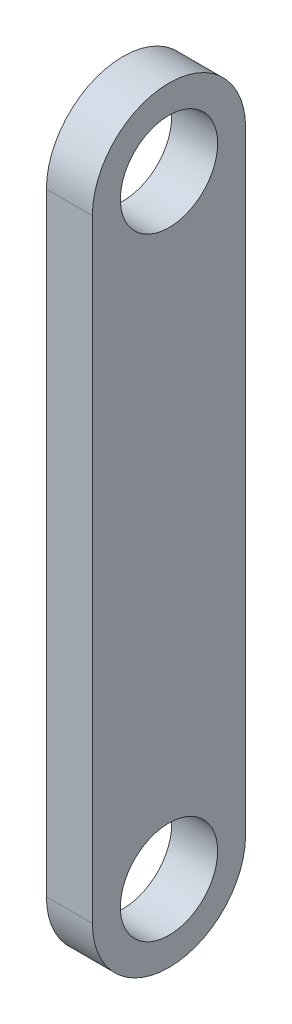
ISO-10303-21;
HEADER;
FILE_DESCRIPTION(('STEP AP214'),'2;1');
FILE_NAME('part.step','',(''),(''),'','','');
FILE_SCHEMA(('AUTOMOTIVE_DESIGN { 1 0 10303 214 1 1 1 1 }'));
ENDSEC;
DATA;
#1=APPLICATION_CONTEXT('core data for automotive mechanical design processes');
#2=APPLICATION_PROTOCOL_DEFINITION('international standard','automotive_design',2000,#1);
#3=PRODUCT_CONTEXT('',#1,'mechanical');
#4=PRODUCT('Part','Part','',(#3));
#5=PRODUCT_RELATED_PRODUCT_CATEGORY('part','',(#4));
#6=PRODUCT_DEFINITION_FORMATION('','',#4);
#7=PRODUCT_DEFINITION_CONTEXT('part definition',#1,'design');
#8=PRODUCT_DEFINITION('design','',#6,#7);
#9=PRODUCT_DEFINITION_SHAPE('','',#8);
#10=(LENGTH_UNIT() NAMED_UNIT(*) SI_UNIT(.MILLI.,.METRE.));
#11=(NAMED_UNIT(*) PLANE_ANGLE_UNIT() SI_UNIT($,.RADIAN.));
#12=(NAMED_UNIT(*) SI_UNIT($,.STERADIAN.) SOLID_ANGLE_UNIT());
#13=UNCERTAINTY_MEASURE_WITH_UNIT(LENGTH_MEASURE(1.E-05),#10,'distance_accuracy_value','');
#14=(GEOMETRIC_REPRESENTATION_CONTEXT(3) GLOBAL_UNCERTAINTY_ASSIGNED_CONTEXT((#13)) GLOBAL_UNIT_ASSIGNED_CONTEXT((#10,
#11,#12)) REPRESENTATION_CONTEXT('',''));
#15=CARTESIAN_POINT('',(0.,0.,0.));
#16=DIRECTION('',(0.,0.,1.));
#17=DIRECTION('',(1.,0.,0.));
#18=AXIS2_PLACEMENT_3D('',#15,#16,#17);
#19=CARTESIAN_POINT('',(3.,-20.,0.));
#20=DIRECTION('',(-1.,0.,0.));
#21=DIRECTION('',(0.,0.,1.));
#22=AXIS2_PLACEMENT_3D('',#19,#20,#21);
#23=CYLINDRICAL_SURFACE('',#22,5.);
#24=DIRECTION('',(-1.,0.,0.));
#25=VECTOR('',#24,1.);
#26=CARTESIAN_POINT('',(3.,-20.,-5.));
#27=LINE('',#26,#25);
#28=CARTESIAN_POINT('',(3.,-20.,-5.));
#29=VERTEX_POINT('',#28);
#30=CARTESIAN_POINT('',(0.,-20.,-5.));
#31=VERTEX_POINT('',#30);
#32=EDGE_CURVE('E90',#29,#31,#27,.T.);
#33=ORIENTED_EDGE('',*,*,#32,.F.);
#34=CARTESIAN_POINT('',(3.,-20.,0.));
#35=DIRECTION('',(-1.,0.,0.));
#36=DIRECTION('',(0.,0.,1.));
#37=AXIS2_PLACEMENT_3D('',#34,#35,#36);
#38=CIRCLE('',#37,5.);
#39=CARTESIAN_POINT('',(3.,-20.,5.));
#40=VERTEX_POINT('',#39);
#41=EDGE_CURVE('E44',#40,#29,#38,.F.);
#42=ORIENTED_EDGE('',*,*,#41,.F.);
#43=DIRECTION('',(1.,0.,0.));
#44=VECTOR('',#43,1.);
#45=CARTESIAN_POINT('',(3.,-20.,5.));
#46=LINE('',#45,#44);
#47=CARTESIAN_POINT('',(0.,-20.,5.));
#48=VERTEX_POINT('',#47);
#49=EDGE_CURVE('E107',#48,#40,#46,.T.);
#50=ORIENTED_EDGE('',*,*,#49,.F.);
#51=CARTESIAN_POINT('',(0.,-20.,0.));
#52=DIRECTION('',(-1.,0.,0.));
#53=DIRECTION('',(0.,0.,1.));
#54=AXIS2_PLACEMENT_3D('',#51,#52,#53);
#55=CIRCLE('',#54,5.);
#56=EDGE_CURVE('E11',#31,#48,#55,.T.);
#57=ORIENTED_EDGE('',*,*,#56,.F.);
#58=EDGE_LOOP('',(#33,#42,#50,#57));
#59=FACE_BOUND('',#58,.T.);
#60=ADVANCED_FACE('F36',(#59),#23,.T.);
#61=CARTESIAN_POINT('',(3.,20.,0.));
#62=DIRECTION('',(-1.,0.,0.));
#63=DIRECTION('',(0.,0.,1.));
#64=AXIS2_PLACEMENT_3D('',#61,#62,#63);
#65=CYLINDRICAL_SURFACE('',#64,5.);
#66=DIRECTION('',(-1.,0.,0.));
#67=VECTOR('',#66,1.);
#68=CARTESIAN_POINT('',(3.,20.,5.));
#69=LINE('',#68,#67);
#70=CARTESIAN_POINT('',(3.,20.,5.));
#71=VERTEX_POINT('',#70);
#72=CARTESIAN_POINT('',(0.,20.,5.));
#73=VERTEX_POINT('',#72);
#74=EDGE_CURVE('E87',#71,#73,#69,.T.);
#75=ORIENTED_EDGE('',*,*,#74,.F.);
#76=CARTESIAN_POINT('',(3.,20.,0.));
#77=DIRECTION('',(-1.,0.,0.));
#78=DIRECTION('',(0.,0.,1.));
#79=AXIS2_PLACEMENT_3D('',#76,#77,#78);
#80=CIRCLE('',#79,5.);
#81=CARTESIAN_POINT('',(3.,20.,-5.));
#82=VERTEX_POINT('',#81);
#83=EDGE_CURVE('E91',#82,#71,#80,.F.);
#84=ORIENTED_EDGE('',*,*,#83,.F.);
#85=DIRECTION('',(1.,0.,0.));
#86=VECTOR('',#85,1.);
#87=CARTESIAN_POINT('',(3.,20.,-5.));
#88=LINE('',#87,#86);
#89=CARTESIAN_POINT('',(0.,20.,-5.));
#90=VERTEX_POINT('',#89);
#91=EDGE_CURVE('E89',#90,#82,#88,.T.);
#92=ORIENTED_EDGE('',*,*,#91,.F.);
#93=CARTESIAN_POINT('',(0.,20.,0.));
#94=DIRECTION('',(-1.,0.,0.));
#95=DIRECTION('',(0.,0.,1.));
#96=AXIS2_PLACEMENT_3D('',#93,#94,#95);
#97=CIRCLE('',#96,5.);
#98=EDGE_CURVE('E76',#73,#90,#97,.T.);
#99=ORIENTED_EDGE('',*,*,#98,.F.);
#100=EDGE_LOOP('',(#75,#84,#92,#99));
#101=FACE_BOUND('',#100,.T.);
#102=ADVANCED_FACE('F85',(#101),#65,.T.);
#103=CARTESIAN_POINT('',(3.,-25.,5.));
#104=DIRECTION('',(0.,0.,1.));
#105=DIRECTION('',(1.,0.,0.));
#106=AXIS2_PLACEMENT_3D('',#103,#104,#105);
#107=PLANE('',#106);
#108=DIRECTION('',(0.,1.,0.));
#109=VECTOR('',#108,1.);
#110=CARTESIAN_POINT('',(0.,-25.,5.));
#111=LINE('',#110,#109);
#112=EDGE_CURVE('E73',#48,#73,#111,.T.);
#113=ORIENTED_EDGE('',*,*,#112,.F.);
#114=ORIENTED_EDGE('',*,*,#49,.T.);
#115=DIRECTION('',(0.,1.,0.));
#116=VECTOR('',#115,1.);
#117=CARTESIAN_POINT('',(3.,-25.,5.));
#118=LINE('',#117,#116);
#119=EDGE_CURVE('E95',#40,#71,#118,.T.);
#120=ORIENTED_EDGE('',*,*,#119,.T.);
#121=ORIENTED_EDGE('',*,*,#74,.T.);
#122=EDGE_LOOP('',(#113,#114,#120,#121));
#123=FACE_BOUND('',#122,.T.);
#124=ADVANCED_FACE('F93',(#123),#107,.T.);
#125=CARTESIAN_POINT('',(3.,-25.,-5.));
#126=DIRECTION('',(0.,0.,1.));
#127=DIRECTION('',(1.,0.,0.));
#128=AXIS2_PLACEMENT_3D('',#125,#126,#127);
#129=PLANE('',#128);
#130=DIRECTION('',(0.,1.,0.));
#131=VECTOR('',#130,1.);
#132=CARTESIAN_POINT('',(3.,-25.,-5.));
#133=LINE('',#132,#131);
#134=EDGE_CURVE('E97',#29,#82,#133,.T.);
#135=ORIENTED_EDGE('',*,*,#134,.F.);
#136=ORIENTED_EDGE('',*,*,#32,.T.);
#137=DIRECTION('',(0.,1.,0.));
#138=VECTOR('',#137,1.);
#139=CARTESIAN_POINT('',(0.,-25.,-5.));
#140=LINE('',#139,#138);
#141=EDGE_CURVE('E80',#31,#90,#140,.T.);
#142=ORIENTED_EDGE('',*,*,#141,.T.);
#143=ORIENTED_EDGE('',*,*,#91,.T.);
#144=EDGE_LOOP('',(#135,#136,#142,#143));
#145=FACE_BOUND('',#144,.T.);
#146=ADVANCED_FACE('F112',(#145),#129,.F.);
#147=CARTESIAN_POINT('',(3.,0.,0.));
#148=DIRECTION('',(-1.,0.,0.));
#149=DIRECTION('',(0.,0.,1.));
#150=AXIS2_PLACEMENT_3D('',#147,#148,#149);
#151=PLANE('',#150);
#152=CARTESIAN_POINT('',(3.,20.,0.));
#153=DIRECTION('',(1.,0.,0.));
#154=DIRECTION('',(0.,0.,-1.));
#155=AXIS2_PLACEMENT_3D('',#152,#153,#154);
#156=CIRCLE('',#155,3.175);
#157=CARTESIAN_POINT('',(3.,20.,-3.175));
#158=VERTEX_POINT('',#157);
#159=EDGE_CURVE('E117',#158,#158,#156,.T.);
#160=ORIENTED_EDGE('',*,*,#159,.F.);
#161=EDGE_LOOP('',(#160));
#162=FACE_BOUND('',#161,.T.);
#163=CARTESIAN_POINT('',(3.,-20.,0.));
#164=DIRECTION('',(1.,0.,0.));
#165=DIRECTION('',(0.,0.,-1.));
#166=AXIS2_PLACEMENT_3D('',#163,#164,#165);
#167=CIRCLE('',#166,3.175);
#168=CARTESIAN_POINT('',(3.,-20.,-3.175));
#169=VERTEX_POINT('',#168);
#170=EDGE_CURVE('E122',#169,#169,#167,.T.);
#171=ORIENTED_EDGE('',*,*,#170,.F.);
#172=EDGE_LOOP('',(#171));
#173=FACE_BOUND('',#172,.T.);
#174=ORIENTED_EDGE('',*,*,#119,.F.);
#175=ORIENTED_EDGE('',*,*,#41,.T.);
#176=ORIENTED_EDGE('',*,*,#134,.T.);
#177=ORIENTED_EDGE('',*,*,#83,.T.);
#178=EDGE_LOOP('',(#174,#175,#176,#177));
#179=FACE_BOUND('',#178,.T.);
#180=ADVANCED_FACE('F109',(#162,#173,#179),#151,.F.);
#181=CARTESIAN_POINT('',(0.,0.,0.));
#182=DIRECTION('',(-1.,0.,0.));
#183=DIRECTION('',(0.,0.,1.));
#184=AXIS2_PLACEMENT_3D('',#181,#182,#183);
#185=PLANE('',#184);
#186=CARTESIAN_POINT('',(0.,20.,0.));
#187=DIRECTION('',(-1.,0.,0.));
#188=DIRECTION('',(0.,0.,1.));
#189=AXIS2_PLACEMENT_3D('',#186,#187,#188);
#190=CIRCLE('',#189,3.175);
#191=CARTESIAN_POINT('',(0.,20.,3.175));
#192=VERTEX_POINT('',#191);
#193=EDGE_CURVE('E81',#192,#192,#190,.T.);
#194=ORIENTED_EDGE('',*,*,#193,.F.);
#195=EDGE_LOOP('',(#194));
#196=FACE_BOUND('',#195,.T.);
#197=CARTESIAN_POINT('',(0.,-20.,0.));
#198=DIRECTION('',(-1.,0.,0.));
#199=DIRECTION('',(0.,0.,1.));
#200=AXIS2_PLACEMENT_3D('',#197,#198,#199);
#201=CIRCLE('',#200,3.175);
#202=CARTESIAN_POINT('',(0.,-20.,3.175));
#203=VERTEX_POINT('',#202);
#204=EDGE_CURVE('E115',#203,#203,#201,.T.);
#205=ORIENTED_EDGE('',*,*,#204,.F.);
#206=EDGE_LOOP('',(#205));
#207=FACE_BOUND('',#206,.T.);
#208=ORIENTED_EDGE('',*,*,#141,.F.);
#209=ORIENTED_EDGE('',*,*,#56,.T.);
#210=ORIENTED_EDGE('',*,*,#112,.T.);
#211=ORIENTED_EDGE('',*,*,#98,.T.);
#212=EDGE_LOOP('',(#208,#209,#210,#211));
#213=FACE_BOUND('',#212,.T.);
#214=ADVANCED_FACE('F75',(#196,#207,#213),#185,.T.);
#215=CARTESIAN_POINT('',(-2.,-20.,0.));
#216=DIRECTION('',(1.,0.,0.));
#217=DIRECTION('',(0.,0.,-1.));
#218=AXIS2_PLACEMENT_3D('',#215,#216,#217);
#219=CYLINDRICAL_SURFACE('',#218,3.175);
#220=ORIENTED_EDGE('',*,*,#204,.T.);
#221=EDGE_LOOP('',(#220));
#222=FACE_BOUND('',#221,.T.);
#223=ORIENTED_EDGE('',*,*,#170,.T.);
#224=EDGE_LOOP('',(#223));
#225=FACE_BOUND('',#224,.T.);
#226=ADVANCED_FACE('F130',(#222,#225),#219,.F.);
#227=CARTESIAN_POINT('',(-2.,20.,0.));
#228=DIRECTION('',(1.,0.,0.));
#229=DIRECTION('',(0.,0.,-1.));
#230=AXIS2_PLACEMENT_3D('',#227,#228,#229);
#231=CYLINDRICAL_SURFACE('',#230,3.175);
#232=ORIENTED_EDGE('',*,*,#193,.T.);
#233=EDGE_LOOP('',(#232));
#234=FACE_BOUND('',#233,.T.);
#235=ORIENTED_EDGE('',*,*,#159,.T.);
#236=EDGE_LOOP('',(#235));
#237=FACE_BOUND('',#236,.T.);
#238=ADVANCED_FACE('F181',(#234,#237),#231,.F.);
#239=CLOSED_SHELL('',(#60,#102,#124,#146,#180,#214,#226,#238));
#240=MANIFOLD_SOLID_BREP('B2',#239);
#241=ADVANCED_BREP_SHAPE_REPRESENTATION('',(#18,#240),#14);
#242=SHAPE_DEFINITION_REPRESENTATION(#9,#241);
ENDSEC;
END-ISO-10303-21;
